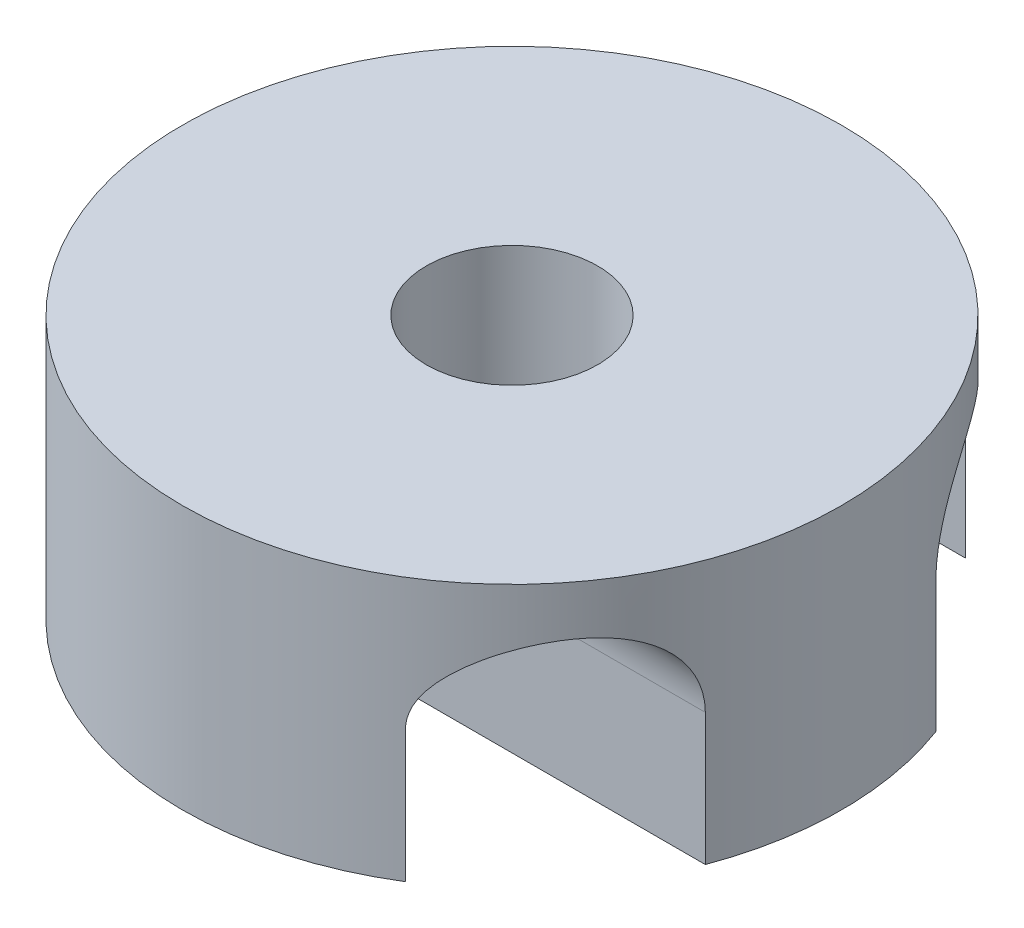
ISO-10303-21;
HEADER;
FILE_DESCRIPTION(('STEP AP214'),'2;1');
FILE_NAME('part.step','',(''),(''),'','','');
FILE_SCHEMA(('AUTOMOTIVE_DESIGN { 1 0 10303 214 1 1 1 1 }'));
ENDSEC;
DATA;
#1=APPLICATION_CONTEXT('core data for automotive mechanical design processes');
#2=APPLICATION_PROTOCOL_DEFINITION('international standard','automotive_design',2000,#1);
#3=PRODUCT_CONTEXT('',#1,'mechanical');
#4=PRODUCT('Part','Part','',(#3));
#5=PRODUCT_RELATED_PRODUCT_CATEGORY('part','',(#4));
#6=PRODUCT_DEFINITION_FORMATION('','',#4);
#7=PRODUCT_DEFINITION_CONTEXT('part definition',#1,'design');
#8=PRODUCT_DEFINITION('design','',#6,#7);
#9=PRODUCT_DEFINITION_SHAPE('','',#8);
#10=(LENGTH_UNIT() NAMED_UNIT(*) SI_UNIT(.MILLI.,.METRE.));
#11=(NAMED_UNIT(*) PLANE_ANGLE_UNIT() SI_UNIT($,.RADIAN.));
#12=(NAMED_UNIT(*) SI_UNIT($,.STERADIAN.) SOLID_ANGLE_UNIT());
#13=UNCERTAINTY_MEASURE_WITH_UNIT(LENGTH_MEASURE(1.E-05),#10,'distance_accuracy_value','');
#14=(GEOMETRIC_REPRESENTATION_CONTEXT(3) GLOBAL_UNCERTAINTY_ASSIGNED_CONTEXT((#13)) GLOBAL_UNIT_ASSIGNED_CONTEXT((#10,
#11,#12)) REPRESENTATION_CONTEXT('',''));
#15=CARTESIAN_POINT('',(0.,0.,0.));
#16=DIRECTION('',(0.,0.,1.));
#17=DIRECTION('',(1.,0.,0.));
#18=AXIS2_PLACEMENT_3D('',#15,#16,#17);
#19=CARTESIAN_POINT('',(0.,0.,0.));
#20=DIRECTION('',(0.,1.,0.));
#21=DIRECTION('',(0.,0.,1.));
#22=AXIS2_PLACEMENT_3D('',#19,#20,#21);
#23=PLANE('',#22);
#24=CARTESIAN_POINT('',(0.,0.,0.));
#25=DIRECTION('',(0.,1.,0.));
#26=DIRECTION('',(0.,0.,1.));
#27=AXIS2_PLACEMENT_3D('',#24,#25,#26);
#28=CIRCLE('',#27,1.651);
#29=CARTESIAN_POINT('',(0.,0.,1.651));
#30=VERTEX_POINT('',#29);
#31=EDGE_CURVE('E121',#30,#30,#28,.T.);
#32=ORIENTED_EDGE('',*,*,#31,.T.);
#33=EDGE_LOOP('',(#32));
#34=FACE_BOUND('',#33,.T.);
#35=DIRECTION('',(-1.,0.,0.));
#36=VECTOR('',#35,1.);
#37=CARTESIAN_POINT('',(7.00617988433738,0.,-2.2225));
#38=LINE('',#37,#36);
#39=CARTESIAN_POINT('',(5.94836059347447,0.,-2.2225));
#40=VERTEX_POINT('',#39);
#41=CARTESIAN_POINT('',(0.,0.,-2.2225));
#42=VERTEX_POINT('',#41);
#43=EDGE_CURVE('E262',#40,#42,#38,.T.);
#44=ORIENTED_EDGE('',*,*,#43,.F.);
#45=CARTESIAN_POINT('',(0.,0.,0.));
#46=DIRECTION('',(0.,1.,0.));
#47=DIRECTION('',(0.,0.,1.));
#48=AXIS2_PLACEMENT_3D('',#45,#46,#47);
#49=CIRCLE('',#48,6.35);
#50=CARTESIAN_POINT('',(5.94836059347447,0.,2.2225));
#51=VERTEX_POINT('',#50);
#52=EDGE_CURVE('E49',#51,#40,#49,.T.);
#53=ORIENTED_EDGE('',*,*,#52,.F.);
#54=DIRECTION('',(1.,0.,0.));
#55=VECTOR('',#54,1.);
#56=CARTESIAN_POINT('',(0.,0.,2.2225));
#57=LINE('',#56,#55);
#58=CARTESIAN_POINT('',(0.,0.,2.2225));
#59=VERTEX_POINT('',#58);
#60=EDGE_CURVE('E174',#59,#51,#57,.T.);
#61=ORIENTED_EDGE('',*,*,#60,.F.);
#62=CARTESIAN_POINT('',(0.,0.,0.));
#63=DIRECTION('',(0.,1.,0.));
#64=DIRECTION('',(0.,0.,-1.));
#65=AXIS2_PLACEMENT_3D('',#62,#63,#64);
#66=CIRCLE('',#65,2.2225);
#67=EDGE_CURVE('E43',#42,#59,#66,.T.);
#68=ORIENTED_EDGE('',*,*,#67,.F.);
#69=EDGE_LOOP('',(#44,#53,#61,#68));
#70=FACE_BOUND('',#69,.T.);
#71=ADVANCED_FACE('F39',(#34,#70),#23,.F.);
#72=CARTESIAN_POINT('',(0.,5.08,0.));
#73=DIRECTION('',(0.,-1.,0.));
#74=DIRECTION('',(0.,0.,-1.));
#75=AXIS2_PLACEMENT_3D('',#72,#73,#74);
#76=CYLINDRICAL_SURFACE('',#75,6.35);
#77=CARTESIAN_POINT('',(0.,5.08,0.));
#78=DIRECTION('',(0.,1.,0.));
#79=DIRECTION('',(0.,0.,1.));
#80=AXIS2_PLACEMENT_3D('',#77,#78,#79);
#81=CIRCLE('',#80,6.35);
#82=CARTESIAN_POINT('',(0.,5.08,6.35));
#83=VERTEX_POINT('',#82);
#84=EDGE_CURVE('E11',#83,#83,#81,.T.);
#85=ORIENTED_EDGE('',*,*,#84,.F.);
#86=EDGE_LOOP('',(#85));
#87=FACE_BOUND('',#86,.T.);
#88=DIRECTION('',(0.,-1.,0.));
#89=VECTOR('',#88,1.);
#90=CARTESIAN_POINT('',(3.34507006653061,1.27,5.3975));
#91=LINE('',#90,#89);
#92=CARTESIAN_POINT('',(3.34507006652884,2.54,5.3975));
#93=VERTEX_POINT('',#92);
#94=CARTESIAN_POINT('',(3.34507006653061,0.,5.3975));
#95=VERTEX_POINT('',#94);
#96=EDGE_CURVE('E63',#93,#95,#91,.T.);
#97=ORIENTED_EDGE('',*,*,#96,.F.);
#98=CARTESIAN_POINT('',(5.94836059347447,2.54,2.2225));
#99=CARTESIAN_POINT('',(5.94835832358748,2.58212873886135,2.2224990610288));
#100=CARTESIAN_POINT('',(5.94773384643831,2.6242370627621,2.22417821665418));
#101=CARTESIAN_POINT('',(5.94522861659639,2.70814670813317,2.2308687928594));
#102=CARTESIAN_POINT('',(5.94334797638651,2.74994805675273,2.23587991507877));
#103=CARTESIAN_POINT('',(5.93581598579431,2.87430354210477,2.25583766864398));
#104=CARTESIAN_POINT('',(5.92827465468238,2.956014821979,2.27570898866582));
#105=CARTESIAN_POINT('',(5.9080071382742,3.11469078973735,2.32781502140145));
#106=CARTESIAN_POINT('',(5.89527935157593,3.19165400312068,2.36005355251134));
#107=CARTESIAN_POINT('',(5.86446914550537,3.33876154887619,2.43560232409667));
#108=CARTESIAN_POINT('',(5.84638727345657,3.40890657726693,2.47891143281611));
#109=CARTESIAN_POINT('',(5.80451202054539,3.54141763891564,2.57544765411664));
#110=CARTESIAN_POINT('',(5.78065351432291,3.6036816713743,2.62878618499652));
#111=CARTESIAN_POINT('',(5.72737166838084,3.71815996843848,2.7429320123225));
#112=CARTESIAN_POINT('',(5.69794684428932,3.77037154484098,2.80374129947801));
#113=CARTESIAN_POINT('',(5.63215611354747,3.8663435835902,2.93374756097584));
#114=CARTESIAN_POINT('',(5.5955175028166,3.90955364971198,3.00321144017914));
#115=CARTESIAN_POINT('',(5.51683764860988,3.98392716544644,3.14541141315939));
#116=CARTESIAN_POINT('',(5.47479480162993,4.01508702856977,3.21814847395012));
#117=CARTESIAN_POINT('',(5.38119308255159,4.06845742413864,3.37257291702332));
#118=CARTESIAN_POINT('',(5.32909738577689,4.08935486858898,3.45438574182686));
#119=CARTESIAN_POINT('',(5.2200613979839,4.11789724771977,3.6170532193894));
#120=CARTESIAN_POINT('',(5.16311848423925,4.12553495940852,3.69790732610437));
#121=CARTESIAN_POINT('',(5.03522280191591,4.12907909554911,3.87072004309037));
#122=CARTESIAN_POINT('',(4.96354795787528,4.12273405051004,3.9621876190562));
#123=CARTESIAN_POINT('',(4.81646318282161,4.09547591790525,4.13974931936101));
#124=CARTESIAN_POINT('',(4.74105064191012,4.07455251379691,4.2258395913494));
#125=CARTESIAN_POINT('',(4.57167722878214,4.01388469586476,4.40918510281611));
#126=CARTESIAN_POINT('',(4.47716963382439,3.97109344474284,4.50494528324074));
#127=CARTESIAN_POINT('',(4.33495744986926,3.89388431605354,4.64057945250455));
#128=CARTESIAN_POINT('',(4.28743304921419,3.8659449253789,4.68449426363894));
#129=CARTESIAN_POINT('',(4.19262187211941,3.80576528432444,4.76953495897004));
#130=CARTESIAN_POINT('',(4.14533500527208,3.77352682314332,4.81066199270906));
#131=CARTESIAN_POINT('',(4.05862086537331,3.70995812039293,4.88393415277602));
#132=CARTESIAN_POINT('',(4.01909394927619,3.67923807326773,4.91649297719177));
#133=CARTESIAN_POINT('',(3.9409176170497,3.61459276872315,4.97937564897764));
#134=CARTESIAN_POINT('',(3.90226784552896,3.58066883924764,5.00970041312352));
#135=CARTESIAN_POINT('',(3.82635575268321,3.50949049308789,5.06791722627807));
#136=CARTESIAN_POINT('',(3.7890913487891,3.47224138763925,5.09581301905295));
#137=CARTESIAN_POINT('',(3.7165407665616,3.39414121947034,5.14896548282318));
#138=CARTESIAN_POINT('',(3.68125341022279,3.35329233979405,5.1742237332937));
#139=CARTESIAN_POINT('',(3.60856239086192,3.26141243096842,5.22522915807943));
#140=CARTESIAN_POINT('',(3.57159968472829,3.20976506600435,5.25051120118989));
#141=CARTESIAN_POINT('',(3.50334498448784,3.10085276572756,5.29629674876956));
#142=CARTESIAN_POINT('',(3.47204622466775,3.04359466035968,5.31680596298366));
#143=CARTESIAN_POINT('',(3.42392060166562,2.9367713963675,5.3478876250299));
#144=CARTESIAN_POINT('',(3.40542355038555,2.88831893505838,5.35965519423118));
#145=CARTESIAN_POINT('',(3.3752067709784,2.78855579581973,5.37873632436665));
#146=CARTESIAN_POINT('',(3.36346694291437,2.73725409765007,5.38606309830967));
#147=CARTESIAN_POINT('',(3.35224378535892,2.66121977288804,5.39304898012775));
#148=CARTESIAN_POINT('',(3.34956541390953,2.63710845444806,5.39471206291081));
#149=CARTESIAN_POINT('',(3.34597461408479,2.58866975821995,5.39693951259093));
#150=CARTESIAN_POINT('',(3.34506474860517,2.56434211811617,5.39750228493943));
#151=CARTESIAN_POINT('',(3.34507006653075,2.54,5.3975));
#152=B_SPLINE_CURVE_WITH_KNOTS('',3,(#98,#99,#100,#101,#102,#103,#104,#105,#106,#107,#108,#109,
#110,#111,#112,#113,#114,#115,#116,#117,#118,#119,#120,#121,#122,#123,#124,#125,#126,#127,#128,
#129,#130,#131,#132,#133,#134,#135,#136,#137,#138,#139,#140,#141,#142,#143,#144,#145,#146,#147,
#148,#149,#150,#151),.UNSPECIFIED.,.F.,.F.,(4,2,2,2,2,2,2,2,2,2,2,2,2,2,2,2,2,2,2,2,2,2,2,2,2,2,
4),(0.,0.126307700925873,0.252604093169524,0.504587717750134,0.756649205374718,1.00868493480504,
1.2637064805433,1.51879612908014,1.7865900632975,2.05446363951522,2.35097842224835,
2.64765467524888,2.99551899711953,3.3436297395155,3.7654408181818,3.97674684151071,
4.18796519580502,4.36699755958602,4.54595604107298,4.72463362274688,4.90320358336435,
5.10779567987462,5.31214174961135,5.47113886637825,5.62966055538371,5.70253091127488,
5.77550679142868),.UNSPECIFIED.);
#153=CARTESIAN_POINT('',(5.94836059347427,2.54,2.2225));
#154=VERTEX_POINT('',#153);
#155=EDGE_CURVE('E195',#154,#93,#152,.T.);
#156=ORIENTED_EDGE('',*,*,#155,.F.);
#157=DIRECTION('',(0.,1.,0.));
#158=VECTOR('',#157,1.);
#159=CARTESIAN_POINT('',(5.94836059347447,1.27,2.2225));
#160=LINE('',#159,#158);
#161=EDGE_CURVE('E192',#51,#154,#160,.T.);
#162=ORIENTED_EDGE('',*,*,#161,.F.);
#163=ORIENTED_EDGE('',*,*,#52,.T.);
#164=DIRECTION('',(0.,-1.,0.));
#165=VECTOR('',#164,1.);
#166=CARTESIAN_POINT('',(5.94836059347447,5.08,-2.2225));
#167=LINE('',#166,#165);
#168=CARTESIAN_POINT('',(5.94836059347447,2.54,-2.2225));
#169=VERTEX_POINT('',#168);
#170=EDGE_CURVE('E117',#169,#40,#167,.T.);
#171=ORIENTED_EDGE('',*,*,#170,.F.);
#172=CARTESIAN_POINT('',(3.34507006653075,2.54,-5.3975));
#173=CARTESIAN_POINT('',(3.34506177274495,2.56580852080798,-5.3975038170099));
#174=CARTESIAN_POINT('',(3.34608637321114,2.59160242900742,-5.39687025143246));
#175=CARTESIAN_POINT('',(3.35012255827613,2.64294156650118,-5.39436628354821));
#176=CARTESIAN_POINT('',(3.35313159926583,2.66848707171439,-5.39249746455322));
#177=CARTESIAN_POINT('',(3.36491922868573,2.74386753991581,-5.38515610376462));
#178=CARTESIAN_POINT('',(3.3764627343995,2.79312136326875,-5.37794644648144));
#179=CARTESIAN_POINT('',(3.4098966848274,2.90251920619687,-5.35682625764473));
#180=CARTESIAN_POINT('',(3.43379692336969,2.9617729461845,-5.34159258728707));
#181=CARTESIAN_POINT('',(3.4889470205276,3.07525574165766,-5.30573648419308));
#182=CARTESIAN_POINT('',(3.52023829009938,3.12945399383819,-5.2850836133309));
#183=CARTESIAN_POINT('',(3.60844352793245,3.26444808521928,-5.22550560941323));
#184=CARTESIAN_POINT('',(3.66928673912606,3.34112232207717,-5.18315090768222));
#185=CARTESIAN_POINT('',(3.79748933586642,3.4828707808405,-5.08998178145815));
#186=CARTESIAN_POINT('',(3.86486057090597,3.54792327499991,-5.03915184773336));
#187=CARTESIAN_POINT('',(3.98520829124238,3.65238922615892,-4.94417978849009));
#188=CARTESIAN_POINT('',(4.03747445073735,3.69411053409755,-4.90163765444903));
#189=CARTESIAN_POINT('',(4.14295237998827,3.77207625062314,-4.81281636367662));
#190=CARTESIAN_POINT('',(4.19616455357972,3.80831825425324,-4.76653557958525));
#191=CARTESIAN_POINT('',(4.3028752213557,3.87538303357948,-4.67043018806566));
#192=CARTESIAN_POINT('',(4.3563738547487,3.90620286965228,-4.62060367875796));
#193=CARTESIAN_POINT('',(4.46308676607741,3.9622778624644,-4.51761903596605));
#194=CARTESIAN_POINT('',(4.51630088624112,3.98753019243465,-4.46445922759017));
#195=CARTESIAN_POINT('',(4.67578478958113,4.05495578509799,-4.29918177955701));
#196=CARTESIAN_POINT('',(4.78099269005764,4.08823146849564,-4.18206944562325));
#197=CARTESIAN_POINT('',(4.93325888824779,4.117419576142,-3.99897629264367));
#198=CARTESIAN_POINT('',(4.98305960449819,4.12369733273171,-3.93675042189794));
#199=CARTESIAN_POINT('',(5.08041424379205,4.12876039709549,-3.81028088839897));
#200=CARTESIAN_POINT('',(5.12796933049516,4.12754962923704,-3.74603830006784));
#201=CARTESIAN_POINT('',(5.23683813649788,4.11507990373289,-3.59300514198917));
#202=CARTESIAN_POINT('',(5.29700429953615,4.10038871758597,-3.50363705506715));
#203=CARTESIAN_POINT('',(5.41090011427771,4.0544165661195,-3.32503654027107));
#204=CARTESIAN_POINT('',(5.46463309092256,4.02314421641194,-3.23580406605821));
#205=CARTESIAN_POINT('',(5.56485738711056,3.94264886856831,-3.06025345542599));
#206=CARTESIAN_POINT('',(5.61128882937401,3.89328749166403,-2.97396354544284));
#207=CARTESIAN_POINT('',(5.69539275037156,3.77667737290553,-2.80954331811824));
#208=CARTESIAN_POINT('',(5.73307196446093,3.7094424718064,-2.73140675197514));
#209=CARTESIAN_POINT('',(5.79488874975794,3.56856922157268,-2.59740352264225));
#210=CARTESIAN_POINT('',(5.8201530453341,3.49691950711942,-2.53996070820819));
#211=CARTESIAN_POINT('',(5.863757866977,3.34325115145933,-2.4376115715246));
#212=CARTESIAN_POINT('',(5.88209931529413,3.26123389334439,-2.39270357961428));
#213=CARTESIAN_POINT('',(5.91075398149945,3.09700484224121,-2.32095975873796));
#214=CARTESIAN_POINT('',(5.92162332234631,3.01542034652849,-2.29289900044516));
#215=CARTESIAN_POINT('',(5.93792070086455,2.84835184375941,-2.2503614498527));
#216=CARTESIAN_POINT('',(5.94335946916037,2.76287587715408,-2.23585787266666));
#217=CARTESIAN_POINT('',(5.94688785390008,2.65407416135563,-2.22643757473753));
#218=CARTESIAN_POINT('',(5.94744068026133,2.63126956096352,-2.2249604021857));
#219=CARTESIAN_POINT('',(5.94817656837301,2.5856463407601,-2.222993090598));
#220=CARTESIAN_POINT('',(5.94836018715193,2.56282779410238,-2.22250146465791));
#221=CARTESIAN_POINT('',(5.94836059347461,2.54,-2.2225));
#222=B_SPLINE_CURVE_WITH_KNOTS('',3,(#172,#173,#174,#175,#176,#177,#178,#179,#180,#181,#182,
#183,#184,#185,#186,#187,#188,#189,#190,#191,#192,#193,#194,#195,#196,#197,#198,#199,#200,#201,
#202,#203,#204,#205,#206,#207,#208,#209,#210,#211,#212,#213,#214,#215,#216,#217,#218,#219,#220,
#221),.UNSPECIFIED.,.F.,.F.,(4,2,2,2,2,2,2,2,2,2,2,2,2,2,2,2,2,2,2,2,2,2,2,2,4),(0.,
0.0773709274128369,0.154642874843087,0.307191843948378,0.503158114711897,0.700249552952321,
1.01845369974905,1.33724666615373,1.57474467289026,1.81234662065774,2.05007698979182,
2.28792778432909,2.76758967533222,3.00711112351227,3.24650706091669,3.57135003672607,
3.89602438852512,4.22323615192005,4.55019526610683,4.8343776907555,5.11852224371287,
5.37815166052293,5.63726703723589,5.70582940988676,5.7742882637029),.UNSPECIFIED.);
#223=CARTESIAN_POINT('',(3.34507006653075,2.54,-5.3975));
#224=VERTEX_POINT('',#223);
#225=EDGE_CURVE('E99',#224,#169,#222,.T.);
#226=ORIENTED_EDGE('',*,*,#225,.F.);
#227=DIRECTION('',(0.,-1.,0.));
#228=VECTOR('',#227,1.);
#229=CARTESIAN_POINT('',(3.34507006653075,5.08,-5.3975));
#230=LINE('',#229,#228);
#231=CARTESIAN_POINT('',(3.34507006653075,0.,-5.3975));
#232=VERTEX_POINT('',#231);
#233=EDGE_CURVE('E111',#232,#224,#230,.F.);
#234=ORIENTED_EDGE('',*,*,#233,.F.);
#235=EDGE_CURVE('E264',#232,#95,#49,.T.);
#236=ORIENTED_EDGE('',*,*,#235,.T.);
#237=EDGE_LOOP('',(#97,#156,#162,#163,#171,#226,#234,#236));
#238=FACE_BOUND('',#237,.T.);
#239=ADVANCED_FACE('F41',(#87,#238),#76,.T.);
#240=CARTESIAN_POINT('',(0.,5.08,0.));
#241=DIRECTION('',(0.,1.,0.));
#242=DIRECTION('',(0.,0.,1.));
#243=AXIS2_PLACEMENT_3D('',#240,#241,#242);
#244=PLANE('',#243);
#245=ORIENTED_EDGE('',*,*,#84,.T.);
#246=EDGE_LOOP('',(#245));
#247=FACE_BOUND('',#246,.T.);
#248=CARTESIAN_POINT('',(0.,5.08,0.));
#249=DIRECTION('',(0.,1.,0.));
#250=DIRECTION('',(0.,0.,1.));
#251=AXIS2_PLACEMENT_3D('',#248,#249,#250);
#252=CIRCLE('',#251,1.651);
#253=CARTESIAN_POINT('',(0.,5.08,1.651));
#254=VERTEX_POINT('',#253);
#255=EDGE_CURVE('E124',#254,#254,#252,.T.);
#256=ORIENTED_EDGE('',*,*,#255,.F.);
#257=EDGE_LOOP('',(#256));
#258=FACE_BOUND('',#257,.T.);
#259=ADVANCED_FACE('F146',(#247,#258),#244,.T.);
#260=ORIENTED_EDGE('',*,*,#235,.F.);
#261=DIRECTION('',(-1.,0.,0.));
#262=VECTOR('',#261,1.);
#263=CARTESIAN_POINT('',(7.00617988433738,0.,-5.3975));
#264=LINE('',#263,#262);
#265=CARTESIAN_POINT('',(0.,0.,-5.3975));
#266=VERTEX_POINT('',#265);
#267=EDGE_CURVE('E106',#232,#266,#264,.T.);
#268=ORIENTED_EDGE('',*,*,#267,.T.);
#269=CARTESIAN_POINT('',(0.,0.,0.));
#270=DIRECTION('',(0.,1.,0.));
#271=DIRECTION('',(0.,0.,-1.));
#272=AXIS2_PLACEMENT_3D('',#269,#270,#271);
#273=CIRCLE('',#272,5.3975);
#274=CARTESIAN_POINT('',(-2.70824762137451E-12,0.,5.3975));
#275=VERTEX_POINT('',#274);
#276=EDGE_CURVE('E162',#266,#275,#273,.T.);
#277=ORIENTED_EDGE('',*,*,#276,.T.);
#278=DIRECTION('',(1.,0.,0.));
#279=VECTOR('',#278,1.);
#280=CARTESIAN_POINT('',(0.,0.,5.3975));
#281=LINE('',#280,#279);
#282=EDGE_CURVE('E57',#275,#95,#281,.T.);
#283=ORIENTED_EDGE('',*,*,#282,.T.);
#284=EDGE_LOOP('',(#260,#268,#277,#283));
#285=FACE_BOUND('',#284,.T.);
#286=ADVANCED_FACE('F143',(#285),#23,.F.);
#287=CARTESIAN_POINT('',(0.,5.08,0.));
#288=DIRECTION('',(0.,-1.,0.));
#289=DIRECTION('',(0.,0.,-1.));
#290=AXIS2_PLACEMENT_3D('',#287,#288,#289);
#291=CYLINDRICAL_SURFACE('',#290,1.651);
#292=ORIENTED_EDGE('',*,*,#255,.T.);
#293=EDGE_LOOP('',(#292));
#294=FACE_BOUND('',#293,.T.);
#295=ORIENTED_EDGE('',*,*,#31,.F.);
#296=EDGE_LOOP('',(#295));
#297=FACE_BOUND('',#296,.T.);
#298=ADVANCED_FACE('F140',(#294,#297),#291,.F.);
#299=CARTESIAN_POINT('',(7.00617988433738,2.54,-2.2225));
#300=DIRECTION('',(0.,0.,1.));
#301=DIRECTION('',(1.,0.,0.));
#302=AXIS2_PLACEMENT_3D('',#299,#300,#301);
#303=PLANE('',#302);
#304=ORIENTED_EDGE('',*,*,#170,.T.);
#305=ORIENTED_EDGE('',*,*,#43,.T.);
#306=DIRECTION('',(0.,1.,0.));
#307=VECTOR('',#306,1.);
#308=CARTESIAN_POINT('',(0.,2.54,-2.2225));
#309=LINE('',#308,#307);
#310=CARTESIAN_POINT('',(0.,2.54,-2.2225));
#311=VERTEX_POINT('',#310);
#312=EDGE_CURVE('E187',#42,#311,#309,.T.);
#313=ORIENTED_EDGE('',*,*,#312,.T.);
#314=DIRECTION('',(-1.,0.,0.));
#315=VECTOR('',#314,1.);
#316=CARTESIAN_POINT('',(7.00617988433738,2.54,-2.2225));
#317=LINE('',#316,#315);
#318=EDGE_CURVE('E107',#169,#311,#317,.T.);
#319=ORIENTED_EDGE('',*,*,#318,.F.);
#320=EDGE_LOOP('',(#304,#305,#313,#319));
#321=FACE_BOUND('',#320,.T.);
#322=ADVANCED_FACE('F139',(#321),#303,.F.);
#323=CARTESIAN_POINT('',(7.00617988433738,2.54,-3.81));
#324=DIRECTION('',(-1.,0.,0.));
#325=DIRECTION('',(0.,0.,1.));
#326=AXIS2_PLACEMENT_3D('',#323,#324,#325);
#327=CYLINDRICAL_SURFACE('',#326,1.5875);
#328=ORIENTED_EDGE('',*,*,#225,.T.);
#329=ORIENTED_EDGE('',*,*,#318,.T.);
#330=CARTESIAN_POINT('',(0.,2.54,-3.81));
#331=DIRECTION('',(-1.,0.,0.));
#332=DIRECTION('',(0.,0.,1.));
#333=AXIS2_PLACEMENT_3D('',#330,#331,#332);
#334=CIRCLE('',#333,1.5875);
#335=CARTESIAN_POINT('',(0.,2.54,-5.3975));
#336=VERTEX_POINT('',#335);
#337=EDGE_CURVE('E102',#311,#336,#334,.T.);
#338=ORIENTED_EDGE('',*,*,#337,.T.);
#339=DIRECTION('',(-1.,0.,0.));
#340=VECTOR('',#339,1.);
#341=CARTESIAN_POINT('',(7.00617988433738,2.54,-5.3975));
#342=LINE('',#341,#340);
#343=EDGE_CURVE('E95',#224,#336,#342,.T.);
#344=ORIENTED_EDGE('',*,*,#343,.F.);
#345=EDGE_LOOP('',(#328,#329,#338,#344));
#346=FACE_BOUND('',#345,.T.);
#347=ADVANCED_FACE('F97',(#346),#327,.F.);
#348=CARTESIAN_POINT('',(7.00617988433738,2.54,-5.3975));
#349=DIRECTION('',(0.,0.,-1.));
#350=DIRECTION('',(-1.,0.,0.));
#351=AXIS2_PLACEMENT_3D('',#348,#349,#350);
#352=PLANE('',#351);
#353=ORIENTED_EDGE('',*,*,#233,.T.);
#354=ORIENTED_EDGE('',*,*,#343,.T.);
#355=DIRECTION('',(0.,-1.,0.));
#356=VECTOR('',#355,1.);
#357=CARTESIAN_POINT('',(0.,2.54,-5.3975));
#358=LINE('',#357,#356);
#359=EDGE_CURVE('E169',#336,#266,#358,.T.);
#360=ORIENTED_EDGE('',*,*,#359,.T.);
#361=ORIENTED_EDGE('',*,*,#267,.F.);
#362=EDGE_LOOP('',(#353,#354,#360,#361));
#363=FACE_BOUND('',#362,.T.);
#364=ADVANCED_FACE('F112',(#363),#352,.F.);
#365=CARTESIAN_POINT('',(0.,0.,-2.2225));
#366=CARTESIAN_POINT('',(-0.583322419022481,0.,-2.2225));
#367=CARTESIAN_POINT('',(-1.16011619937372,0.,-1.98297344300049));
#368=CARTESIAN_POINT('',(-1.98297344300049,0.,-1.16011619937372));
#369=CARTESIAN_POINT('',(-2.2225,0.,-0.58184793691743));
#370=CARTESIAN_POINT('',(-2.2225,0.,0.581847936917438));
#371=CARTESIAN_POINT('',(-1.98297344300032,0.,1.16011619937377));
#372=CARTESIAN_POINT('',(-1.36583051028049,0.,1.77725913209377));
#373=CARTESIAN_POINT('',(-1.11950411647658,0.,1.94190287697265));
#374=CARTESIAN_POINT('',(-0.716018834408817,0.,2.10903195302318));
#375=CARTESIAN_POINT('',(-0.576048449339283,0.,2.15147096884471));
#376=CARTESIAN_POINT('',(-0.362076145259762,0.,2.19401352299666));
#377=CARTESIAN_POINT('',(-0.290082778974273,0.,2.20468626051726));
#378=CARTESIAN_POINT('',(-0.181578096339217,0.,2.21536824567185));
#379=CARTESIAN_POINT('',(-0.145323648975223,0.,2.2180415648846));
#380=CARTESIAN_POINT('',(-0.0727173780643446,0.,2.22160742017352));
#381=CARTESIAN_POINT('',(-0.0493532376384455,0.,2.2224976138175));
#382=CARTESIAN_POINT('',(0.0577766130416832,0.,2.22250279344476));
#383=CARTESIAN_POINT('',(0.145962080923696,0.,2.2225));
#384=CARTESIAN_POINT('',(0.291924161847394,0.,2.2225));
#385=CARTESIAN_POINT('',(0.364905202309247,0.,2.2225));
#386=CARTESIAN_POINT('',(0.583848323694788,0.,2.2225));
#387=CARTESIAN_POINT('',(0.729810404618452,0.,2.2225));
#388=CARTESIAN_POINT('',(1.16769664738959,0.,2.2225));
#389=CARTESIAN_POINT('',(1.45962080923702,0.,2.2225));
#390=CARTESIAN_POINT('',(2.33539329477902,0.,2.2225));
#391=CARTESIAN_POINT('',(2.91924161847396,0.,2.2225));
#392=CARTESIAN_POINT('',(4.67078658955814,0.,2.2225));
#393=CARTESIAN_POINT('',(5.8384832369479,0.,2.2225));
#394=CARTESIAN_POINT('',(7.00617988433738,0.,2.2225));
#395=CARTESIAN_POINT('',(0.,2.54,-2.2225));
#396=CARTESIAN_POINT('',(-0.583322419022481,2.54,-2.2225));
#397=CARTESIAN_POINT('',(-1.16011619937372,2.54,-1.98297344300049));
#398=CARTESIAN_POINT('',(-1.98297344300049,2.54,-1.16011619937372));
#399=CARTESIAN_POINT('',(-2.2225,2.54,-0.58184793691743));
#400=CARTESIAN_POINT('',(-2.2225,2.54,0.581847936917438));
#401=CARTESIAN_POINT('',(-1.98297344300032,2.54,1.16011619937377));
#402=CARTESIAN_POINT('',(-1.36583051028049,2.54,1.77725913209377));
#403=CARTESIAN_POINT('',(-1.11950411647658,2.54,1.94190287697265));
#404=CARTESIAN_POINT('',(-0.716018834408817,2.54,2.10903195302318));
#405=CARTESIAN_POINT('',(-0.576048449339283,2.54,2.15147096884471));
#406=CARTESIAN_POINT('',(-0.362076145259762,2.54,2.19401352299666));
#407=CARTESIAN_POINT('',(-0.290082778974273,2.54,2.20468626051726));
#408=CARTESIAN_POINT('',(-0.181578096339217,2.54,2.21536824567185));
#409=CARTESIAN_POINT('',(-0.145323648975223,2.54,2.2180415648846));
#410=CARTESIAN_POINT('',(-0.0727173780643446,2.54,2.22160742017352));
#411=CARTESIAN_POINT('',(-0.0493532376384455,2.54,2.2224976138175));
#412=CARTESIAN_POINT('',(0.0577766130416832,2.54,2.22250279344476));
#413=CARTESIAN_POINT('',(0.145962080923696,2.54,2.2225));
#414=CARTESIAN_POINT('',(0.291924161847394,2.54,2.2225));
#415=CARTESIAN_POINT('',(0.364905202309247,2.54,2.2225));
#416=CARTESIAN_POINT('',(0.583848323694788,2.54,2.2225));
#417=CARTESIAN_POINT('',(0.729810404618452,2.54,2.2225));
#418=CARTESIAN_POINT('',(1.16769664738959,2.54,2.2225));
#419=CARTESIAN_POINT('',(1.45962080923702,2.54,2.2225));
#420=CARTESIAN_POINT('',(2.33539329477902,2.54,2.2225));
#421=CARTESIAN_POINT('',(2.91924161847396,2.54,2.2225));
#422=CARTESIAN_POINT('',(4.67078658955814,2.54,2.2225));
#423=CARTESIAN_POINT('',(5.8384832369479,2.54,2.2225));
#424=CARTESIAN_POINT('',(7.00617988433738,2.54,2.2225));
#425=B_SPLINE_SURFACE_WITH_KNOTS('',1,3,((#365,#366,#367,#368,#369,#370,#371,#372,#373,#374,
#375,#376,#377,#378,#379,#380,#381,#382,#383,#384,#385,#386,#387,#388,#389,#390,#391,#392,#393,
#394),(#395,#396,#397,#398,#399,#400,#401,#402,#403,#404,#405,#406,#407,#408,#409,#410,#411,
#412,#413,#414,#415,#416,#417,#418,#419,#420,#421,#422,#423,#424)),.UNSPECIFIED.,.F.,.F.,.F.,(2,
2),(4,2,2,2,2,2,2,2,2,2,2,2,2,2,4),(0.,1.),(0.269656928833934,0.384828464416967,0.5,
0.615171535583033,0.67275730337455,0.701550187270308,0.715946629218187,0.723144850192127,
0.730343071166066,0.738769850192127,0.747196629218187,0.764050187270308,0.79775730337455,
0.865171535583033,1.),.UNSPECIFIED.);
#426=CARTESIAN_POINT('',(0.,2.54,-2.2225));
#427=CARTESIAN_POINT('',(-0.583322419022481,2.54,-2.2225));
#428=CARTESIAN_POINT('',(-1.16011619937372,2.54,-1.98297344300049));
#429=CARTESIAN_POINT('',(-1.98297344300049,2.54,-1.16011619937372));
#430=CARTESIAN_POINT('',(-2.2225,2.54,-0.58184793691743));
#431=CARTESIAN_POINT('',(-2.2225,2.54,0.581847936917438));
#432=CARTESIAN_POINT('',(-1.98297344300032,2.54,1.16011619937377));
#433=CARTESIAN_POINT('',(-1.36583051028049,2.54,1.77725913209377));
#434=CARTESIAN_POINT('',(-1.11950411647658,2.54,1.94190287697265));
#435=CARTESIAN_POINT('',(-0.716018834408817,2.54,2.10903195302318));
#436=CARTESIAN_POINT('',(-0.576048449339283,2.54,2.15147096884471));
#437=CARTESIAN_POINT('',(-0.362076145259762,2.54,2.19401352299666));
#438=CARTESIAN_POINT('',(-0.290082778974273,2.54,2.20468626051726));
#439=CARTESIAN_POINT('',(-0.181578096339217,2.54,2.21536824567185));
#440=CARTESIAN_POINT('',(-0.145323648975223,2.54,2.2180415648846));
#441=CARTESIAN_POINT('',(-0.0727173780643446,2.54,2.22160742017352));
#442=CARTESIAN_POINT('',(-0.0493532376384455,2.54,2.2224976138175));
#443=CARTESIAN_POINT('',(0.0577766130416832,2.54,2.22250279344476));
#444=CARTESIAN_POINT('',(0.145962080923696,2.54,2.2225));
#445=CARTESIAN_POINT('',(0.291924161847394,2.54,2.2225));
#446=CARTESIAN_POINT('',(0.364905202309247,2.54,2.2225));
#447=CARTESIAN_POINT('',(0.583848323694788,2.54,2.2225));
#448=CARTESIAN_POINT('',(0.729810404618452,2.54,2.2225));
#449=CARTESIAN_POINT('',(1.16769664738959,2.54,2.2225));
#450=CARTESIAN_POINT('',(1.45962080923702,2.54,2.2225));
#451=CARTESIAN_POINT('',(2.33539329477902,2.54,2.2225));
#452=CARTESIAN_POINT('',(2.91924161847396,2.54,2.2225));
#453=CARTESIAN_POINT('',(4.67078658955814,2.54,2.2225));
#454=CARTESIAN_POINT('',(5.8384832369479,2.54,2.2225));
#455=CARTESIAN_POINT('',(7.00617988433738,2.54,2.2225));
#456=B_SPLINE_CURVE_WITH_KNOTS('',3,(#426,#427,#428,#429,#430,#431,#432,#433,#434,#435,#436,
#437,#438,#439,#440,#441,#442,#443,#444,#445,#446,#447,#448,#449,#450,#451,#452,#453,#454,#455),
.UNSPECIFIED.,.F.,.F.,(4,2,2,2,2,2,2,2,2,2,2,2,2,2,4),(0.269656928833934,0.384828464416967,0.5,
0.615171535583033,0.67275730337455,0.701550187270308,0.715946629218187,0.723144850192127,
0.730343071166066,0.738769850192127,0.747196629218187,0.764050187270308,0.79775730337455,
0.865171535583033,1.),.UNSPECIFIED.);
#457=EDGE_CURVE('E183',#311,#154,#456,.T.);
#458=ORIENTED_EDGE('',*,*,#161,.T.);
#459=ORIENTED_EDGE('',*,*,#457,.F.);
#460=ORIENTED_EDGE('',*,*,#312,.F.);
#461=ORIENTED_EDGE('',*,*,#67,.T.);
#462=ORIENTED_EDGE('',*,*,#60,.T.);
#463=EDGE_LOOP('',(#458,#459,#460,#461,#462));
#464=FACE_BOUND('',#463,.T.);
#465=ADVANCED_FACE('F213',(#464),#425,.F.);
#466=CARTESIAN_POINT('',(0.,2.54,-2.2225));
#467=CARTESIAN_POINT('',(-0.583322419022481,2.54,-2.2225));
#468=CARTESIAN_POINT('',(-1.16011619937372,2.54,-1.98297344300049));
#469=CARTESIAN_POINT('',(-1.98297344300049,2.54,-1.16011619937372));
#470=CARTESIAN_POINT('',(-2.2225,2.54,-0.58184793691743));
#471=CARTESIAN_POINT('',(-2.2225,2.54,0.581847936917438));
#472=CARTESIAN_POINT('',(-1.98297344300032,2.54,1.16011619937377));
#473=CARTESIAN_POINT('',(-1.36583051028049,2.54,1.77725913209377));
#474=CARTESIAN_POINT('',(-1.11950411647658,2.54,1.94190287697265));
#475=CARTESIAN_POINT('',(-0.716018834408817,2.54,2.10903195302318));
#476=CARTESIAN_POINT('',(-0.576048449339283,2.54,2.15147096884471));
#477=CARTESIAN_POINT('',(-0.362076145259762,2.54,2.19401352299666));
#478=CARTESIAN_POINT('',(-0.290082778974273,2.54,2.20468626051726));
#479=CARTESIAN_POINT('',(-0.181578096339217,2.54,2.21536824567185));
#480=CARTESIAN_POINT('',(-0.145323648975223,2.54,2.2180415648846));
#481=CARTESIAN_POINT('',(-0.0727173780643446,2.54,2.22160742017352));
#482=CARTESIAN_POINT('',(-0.0493532376384455,2.54,2.2224976138175));
#483=CARTESIAN_POINT('',(0.0577766130416832,2.54,2.22250279344476));
#484=CARTESIAN_POINT('',(0.145962080923696,2.54,2.2225));
#485=CARTESIAN_POINT('',(0.291924161847394,2.54,2.2225));
#486=CARTESIAN_POINT('',(0.364905202309247,2.54,2.2225));
#487=CARTESIAN_POINT('',(0.583848323694788,2.54,2.2225));
#488=CARTESIAN_POINT('',(0.729810404618452,2.54,2.2225));
#489=CARTESIAN_POINT('',(1.16769664738959,2.54,2.2225));
#490=CARTESIAN_POINT('',(1.45962080923702,2.54,2.2225));
#491=CARTESIAN_POINT('',(2.33539329477902,2.54,2.2225));
#492=CARTESIAN_POINT('',(2.91924161847396,2.54,2.2225));
#493=CARTESIAN_POINT('',(4.67078658955814,2.54,2.2225));
#494=CARTESIAN_POINT('',(5.8384832369479,2.54,2.2225));
#495=CARTESIAN_POINT('',(7.00617988433738,2.54,2.2225));
#496=CARTESIAN_POINT('',(0.,5.715,-2.2225));
#497=CARTESIAN_POINT('',(-0.583322419022481,5.715,-2.2225));
#498=CARTESIAN_POINT('',(-1.16011619937372,5.715,-1.98297344300049));
#499=CARTESIAN_POINT('',(-1.98297344300049,5.715,-1.16011619937372));
#500=CARTESIAN_POINT('',(-2.2225,5.715,-0.58184793691743));
#501=CARTESIAN_POINT('',(-2.2225,5.715,0.581847936917438));
#502=CARTESIAN_POINT('',(-1.98297344300032,5.715,1.16011619937377));
#503=CARTESIAN_POINT('',(-1.36583051028049,5.715,1.77725913209377));
#504=CARTESIAN_POINT('',(-1.11950411647658,5.715,1.94190287697265));
#505=CARTESIAN_POINT('',(-0.716018834408817,5.715,2.10903195302318));
#506=CARTESIAN_POINT('',(-0.576048449339283,5.715,2.15147096884471));
#507=CARTESIAN_POINT('',(-0.362076145259762,5.715,2.19401352299666));
#508=CARTESIAN_POINT('',(-0.290082778974273,5.715,2.20468626051726));
#509=CARTESIAN_POINT('',(-0.181578096339217,5.715,2.21536824567185));
#510=CARTESIAN_POINT('',(-0.145323648975223,5.715,2.2180415648846));
#511=CARTESIAN_POINT('',(-0.0727173780643446,5.715,2.22160742017352));
#512=CARTESIAN_POINT('',(-0.0493532376384455,5.715,2.2224976138175));
#513=CARTESIAN_POINT('',(0.0577766130416832,5.715,2.22250279344476));
#514=CARTESIAN_POINT('',(0.145962080923696,5.715,2.2225));
#515=CARTESIAN_POINT('',(0.291924161847394,5.715,2.2225));
#516=CARTESIAN_POINT('',(0.364905202309247,5.715,2.2225));
#517=CARTESIAN_POINT('',(0.583848323694788,5.715,2.2225));
#518=CARTESIAN_POINT('',(0.729810404618452,5.715,2.2225));
#519=CARTESIAN_POINT('',(1.16769664738959,5.715,2.2225));
#520=CARTESIAN_POINT('',(1.45962080923702,5.715,2.2225));
#521=CARTESIAN_POINT('',(2.33539329477902,5.715,2.2225));
#522=CARTESIAN_POINT('',(2.91924161847396,5.715,2.2225));
#523=CARTESIAN_POINT('',(4.67078658955814,5.715,2.2225));
#524=CARTESIAN_POINT('',(5.8384832369479,5.715,2.2225));
#525=CARTESIAN_POINT('',(7.00617988433738,5.715,2.2225));
#526=CARTESIAN_POINT('',(0.,5.715,-5.3975));
#527=CARTESIAN_POINT('',(-1.41664016048311,5.715,-5.3975));
#528=CARTESIAN_POINT('',(-2.81742505562196,5.715,-4.81579264728725));
#529=CARTESIAN_POINT('',(-4.81579264728682,5.715,-2.81742505562152));
#530=CARTESIAN_POINT('',(-5.3975,5.715,-1.4130592753709));
#531=CARTESIAN_POINT('',(-5.3975,5.715,1.41305927537092));
#532=CARTESIAN_POINT('',(-4.81579264728631,5.715,2.81742505562203));
#533=CARTESIAN_POINT('',(-3.31701695353842,5.715,4.31620074937057));
#534=CARTESIAN_POINT('',(-2.71879571144312,5.715,4.71604984407657));
#535=CARTESIAN_POINT('',(-1.73890288356427,5.715,5.12193474305623));
#536=CARTESIAN_POINT('',(-1.39897480553825,5.715,5.22500092433718));
#537=CARTESIAN_POINT('',(-0.879327781345144,5.715,5.32831855584903));
#538=CARTESIAN_POINT('',(-0.70448674893752,5.715,5.35423806125617));
#539=CARTESIAN_POINT('',(-0.440975376823813,5.715,5.38018002520309));
#540=CARTESIAN_POINT('',(-0.35292886179697,5.715,5.38667237186257));
#541=CARTESIAN_POINT('',(-0.176599346727694,5.715,5.39533230613571));
#542=CARTESIAN_POINT('',(-0.0753285919651155,5.715,5.39749420498535));
#543=CARTESIAN_POINT('',(0.0881853170571528,5.715,5.39750678408014));
#544=CARTESIAN_POINT('',(0.145962080923696,5.715,5.3975));
#545=CARTESIAN_POINT('',(0.291924161847394,5.715,5.3975));
#546=CARTESIAN_POINT('',(0.364905202309247,5.715,5.3975));
#547=CARTESIAN_POINT('',(0.583848323694788,5.715,5.3975));
#548=CARTESIAN_POINT('',(0.729810404618452,5.715,5.3975));
#549=CARTESIAN_POINT('',(1.16769664738959,5.715,5.3975));
#550=CARTESIAN_POINT('',(1.45962080923702,5.715,5.3975));
#551=CARTESIAN_POINT('',(2.33539329477902,5.715,5.3975));
#552=CARTESIAN_POINT('',(2.91924161847396,5.715,5.3975));
#553=CARTESIAN_POINT('',(4.67078658955814,5.715,5.3975));
#554=CARTESIAN_POINT('',(5.8384832369479,5.715,5.3975));
#555=CARTESIAN_POINT('',(7.00617988433738,5.715,5.3975));
#556=CARTESIAN_POINT('',(0.,2.54,-5.3975));
#557=CARTESIAN_POINT('',(-1.41664016048311,2.54,-5.3975));
#558=CARTESIAN_POINT('',(-2.81742505562196,2.54,-4.81579264728725));
#559=CARTESIAN_POINT('',(-4.81579264728682,2.54,-2.81742505562152));
#560=CARTESIAN_POINT('',(-5.3975,2.54,-1.4130592753709));
#561=CARTESIAN_POINT('',(-5.3975,2.54,1.41305927537092));
#562=CARTESIAN_POINT('',(-4.81579264728631,2.54,2.81742505562203));
#563=CARTESIAN_POINT('',(-3.31701695353842,2.54,4.31620074937057));
#564=CARTESIAN_POINT('',(-2.71879571144312,2.54,4.71604984407657));
#565=CARTESIAN_POINT('',(-1.73890288356427,2.54,5.12193474305623));
#566=CARTESIAN_POINT('',(-1.39897480553825,2.54,5.22500092433718));
#567=CARTESIAN_POINT('',(-0.879327781345144,2.54,5.32831855584903));
#568=CARTESIAN_POINT('',(-0.70448674893752,2.54,5.35423806125617));
#569=CARTESIAN_POINT('',(-0.440975376823813,2.54,5.38018002520309));
#570=CARTESIAN_POINT('',(-0.35292886179697,2.54,5.38667237186257));
#571=CARTESIAN_POINT('',(-0.176599346727694,2.54,5.39533230613571));
#572=CARTESIAN_POINT('',(-0.0753285919651155,2.54,5.39749420498535));
#573=CARTESIAN_POINT('',(0.0881853170571528,2.54,5.39750678408014));
#574=CARTESIAN_POINT('',(0.145962080923696,2.54,5.3975));
#575=CARTESIAN_POINT('',(0.291924161847394,2.54,5.3975));
#576=CARTESIAN_POINT('',(0.364905202309247,2.54,5.3975));
#577=CARTESIAN_POINT('',(0.583848323694788,2.54,5.3975));
#578=CARTESIAN_POINT('',(0.729810404618452,2.54,5.3975));
#579=CARTESIAN_POINT('',(1.16769664738959,2.54,5.3975));
#580=CARTESIAN_POINT('',(1.45962080923702,2.54,5.3975));
#581=CARTESIAN_POINT('',(2.33539329477902,2.54,5.3975));
#582=CARTESIAN_POINT('',(2.91924161847396,2.54,5.3975));
#583=CARTESIAN_POINT('',(4.67078658955814,2.54,5.3975));
#584=CARTESIAN_POINT('',(5.8384832369479,2.54,5.3975));
#585=CARTESIAN_POINT('',(7.00617988433738,2.54,5.3975));
#586=(BOUNDED_SURFACE() B_SPLINE_SURFACE(3,3,((#466,#467,#468,#469,#470,#471,#472,#473,#474,
#475,#476,#477,#478,#479,#480,#481,#482,#483,#484,#485,#486,#487,#488,#489,#490,#491,#492,#493,
#494,#495),(#496,#497,#498,#499,#500,#501,#502,#503,#504,#505,#506,#507,#508,#509,#510,#511,
#512,#513,#514,#515,#516,#517,#518,#519,#520,#521,#522,#523,#524,#525),(#526,#527,#528,#529,
#530,#531,#532,#533,#534,#535,#536,#537,#538,#539,#540,#541,#542,#543,#544,#545,#546,#547,#548,
#549,#550,#551,#552,#553,#554,#555),(#556,#557,#558,#559,#560,#561,#562,#563,#564,#565,#566,
#567,#568,#569,#570,#571,#572,#573,#574,#575,#576,#577,#578,#579,#580,#581,#582,#583,#584,
#585)),.UNSPECIFIED.,.F.,.F.,.F.) B_SPLINE_SURFACE_WITH_KNOTS((4,4),(4,2,2,2,2,2,2,2,2,2,2,2,2,
2,4),(0.,1.),(0.269656928833934,0.384828464416967,0.5,0.615171535583033,0.67275730337455,
0.701550187270308,0.715946629218187,0.723144850192127,0.730343071166066,0.738769850192127,
0.747196629218187,0.764050187270308,0.79775730337455,0.865171535583033,1.),
.UNSPECIFIED.) GEOMETRIC_REPRESENTATION_ITEM() RATIONAL_B_SPLINE_SURFACE(((1.,1.,1.,1.,1.,1.,1.,
1.,1.,1.,1.,1.,1.,1.,1.,1.,1.,1.,1.,1.,1.,1.,1.,1.,1.,1.,1.,1.,1.,1.),(0.333333333333333,
0.333333333333333,0.333333333333333,0.333333333333333,0.333333333333333,0.333333333333333,
0.333333333333333,0.333333333333333,0.333333333333333,0.333333333333333,0.333333333333333,
0.333333333333333,0.333333333333333,0.333333333333333,0.333333333333333,0.333333333333333,
0.333333333333333,0.333333333333333,0.333333333333333,0.333333333333333,0.333333333333333,
0.333333333333333,0.333333333333333,0.333333333333333,0.333333333333333,0.333333333333333,
0.333333333333333,0.333333333333333,0.333333333333333,0.333333333333333),(0.333333333333333,
0.333333333333333,0.333333333333333,0.333333333333333,0.333333333333333,0.333333333333333,
0.333333333333333,0.333333333333333,0.333333333333333,0.333333333333333,0.333333333333333,
0.333333333333333,0.333333333333333,0.333333333333333,0.333333333333333,0.333333333333333,
0.333333333333333,0.333333333333333,0.333333333333333,0.333333333333333,0.333333333333333,
0.333333333333333,0.333333333333333,0.333333333333333,0.333333333333333,0.333333333333333,
0.333333333333333,0.333333333333333,0.333333333333333,0.333333333333333),(1.,1.,1.,1.,1.,1.,1.,
1.,1.,1.,1.,1.,1.,1.,1.,1.,1.,1.,1.,1.,1.,1.,1.,1.,1.,1.,1.,1.,1.,1.))) REPRESENTATION_ITEM('') SURFACE());
#587=CARTESIAN_POINT('',(0.,2.54,-5.3975));
#588=CARTESIAN_POINT('',(-1.41664016048311,2.54,-5.3975));
#589=CARTESIAN_POINT('',(-2.81742505562196,2.54,-4.81579264728725));
#590=CARTESIAN_POINT('',(-4.81579264728682,2.54,-2.81742505562152));
#591=CARTESIAN_POINT('',(-5.3975,2.54,-1.4130592753709));
#592=CARTESIAN_POINT('',(-5.3975,2.54,1.41305927537092));
#593=CARTESIAN_POINT('',(-4.81579264728631,2.54,2.81742505562203));
#594=CARTESIAN_POINT('',(-3.31701695353842,2.54,4.31620074937057));
#595=CARTESIAN_POINT('',(-2.71879571144312,2.54,4.71604984407657));
#596=CARTESIAN_POINT('',(-1.73890288356427,2.54,5.12193474305623));
#597=CARTESIAN_POINT('',(-1.39897480553825,2.54,5.22500092433718));
#598=CARTESIAN_POINT('',(-0.879327781345144,2.54,5.32831855584903));
#599=CARTESIAN_POINT('',(-0.70448674893752,2.54,5.35423806125617));
#600=CARTESIAN_POINT('',(-0.440975376823813,2.54,5.38018002520309));
#601=CARTESIAN_POINT('',(-0.35292886179697,2.54,5.38667237186257));
#602=CARTESIAN_POINT('',(-0.176599346727694,2.54,5.39533230613571));
#603=CARTESIAN_POINT('',(-0.0753285919651155,2.54,5.39749420498535));
#604=CARTESIAN_POINT('',(0.0881853170571528,2.54,5.39750678408014));
#605=CARTESIAN_POINT('',(0.145962080923696,2.54,5.3975));
#606=CARTESIAN_POINT('',(0.291924161847394,2.54,5.3975));
#607=CARTESIAN_POINT('',(0.364905202309247,2.54,5.3975));
#608=CARTESIAN_POINT('',(0.583848323694788,2.54,5.3975));
#609=CARTESIAN_POINT('',(0.729810404618452,2.54,5.3975));
#610=CARTESIAN_POINT('',(1.16769664738959,2.54,5.3975));
#611=CARTESIAN_POINT('',(1.45962080923702,2.54,5.3975));
#612=CARTESIAN_POINT('',(2.33539329477902,2.54,5.3975));
#613=CARTESIAN_POINT('',(2.91924161847396,2.54,5.3975));
#614=CARTESIAN_POINT('',(4.67078658955814,2.54,5.3975));
#615=CARTESIAN_POINT('',(5.8384832369479,2.54,5.3975));
#616=CARTESIAN_POINT('',(7.00617988433738,2.54,5.3975));
#617=B_SPLINE_CURVE_WITH_KNOTS('',3,(#587,#588,#589,#590,#591,#592,#593,#594,#595,#596,#597,
#598,#599,#600,#601,#602,#603,#604,#605,#606,#607,#608,#609,#610,#611,#612,#613,#614,#615,#616),
.UNSPECIFIED.,.F.,.F.,(4,2,2,2,2,2,2,2,2,2,2,2,2,2,4),(0.269656928833934,0.384828464416967,0.5,
0.615171535583033,0.67275730337455,0.701550187270308,0.715946629218187,0.723144850192127,
0.730343071166066,0.738769850192127,0.747196629218187,0.764050187270308,0.79775730337455,
0.865171535583033,1.),.UNSPECIFIED.);
#618=EDGE_CURVE('E254',#336,#93,#617,.T.);
#619=ORIENTED_EDGE('',*,*,#155,.T.);
#620=ORIENTED_EDGE('',*,*,#618,.F.);
#621=ORIENTED_EDGE('',*,*,#337,.F.);
#622=ORIENTED_EDGE('',*,*,#457,.T.);
#623=EDGE_LOOP('',(#619,#620,#621,#622));
#624=FACE_BOUND('',#623,.T.);
#625=ADVANCED_FACE('F219',(#624),#586,.F.);
#626=CARTESIAN_POINT('',(0.,2.54,-5.3975));
#627=CARTESIAN_POINT('',(-1.41664016048311,2.54,-5.3975));
#628=CARTESIAN_POINT('',(-2.81742505562196,2.54,-4.81579264728725));
#629=CARTESIAN_POINT('',(-4.81579264728682,2.54,-2.81742505562152));
#630=CARTESIAN_POINT('',(-5.3975,2.54,-1.4130592753709));
#631=CARTESIAN_POINT('',(-5.3975,2.54,1.41305927537092));
#632=CARTESIAN_POINT('',(-4.81579264728631,2.54,2.81742505562203));
#633=CARTESIAN_POINT('',(-3.31701695353842,2.54,4.31620074937057));
#634=CARTESIAN_POINT('',(-2.71879571144312,2.54,4.71604984407657));
#635=CARTESIAN_POINT('',(-1.73890288356427,2.54,5.12193474305623));
#636=CARTESIAN_POINT('',(-1.39897480553825,2.54,5.22500092433718));
#637=CARTESIAN_POINT('',(-0.879327781345144,2.54,5.32831855584903));
#638=CARTESIAN_POINT('',(-0.70448674893752,2.54,5.35423806125617));
#639=CARTESIAN_POINT('',(-0.440975376823813,2.54,5.38018002520309));
#640=CARTESIAN_POINT('',(-0.35292886179697,2.54,5.38667237186257));
#641=CARTESIAN_POINT('',(-0.176599346727694,2.54,5.39533230613571));
#642=CARTESIAN_POINT('',(-0.0753285919651155,2.54,5.39749420498535));
#643=CARTESIAN_POINT('',(0.0881853170571528,2.54,5.39750678408014));
#644=CARTESIAN_POINT('',(0.145962080923696,2.54,5.3975));
#645=CARTESIAN_POINT('',(0.291924161847394,2.54,5.3975));
#646=CARTESIAN_POINT('',(0.364905202309247,2.54,5.3975));
#647=CARTESIAN_POINT('',(0.583848323694788,2.54,5.3975));
#648=CARTESIAN_POINT('',(0.729810404618452,2.54,5.3975));
#649=CARTESIAN_POINT('',(1.16769664738959,2.54,5.3975));
#650=CARTESIAN_POINT('',(1.45962080923702,2.54,5.3975));
#651=CARTESIAN_POINT('',(2.33539329477902,2.54,5.3975));
#652=CARTESIAN_POINT('',(2.91924161847396,2.54,5.3975));
#653=CARTESIAN_POINT('',(4.67078658955814,2.54,5.3975));
#654=CARTESIAN_POINT('',(5.8384832369479,2.54,5.3975));
#655=CARTESIAN_POINT('',(7.00617988433738,2.54,5.3975));
#656=CARTESIAN_POINT('',(0.,0.,-5.3975));
#657=CARTESIAN_POINT('',(-1.41664016048311,0.,-5.3975));
#658=CARTESIAN_POINT('',(-2.81742505562196,0.,-4.81579264728725));
#659=CARTESIAN_POINT('',(-4.81579264728682,0.,-2.81742505562152));
#660=CARTESIAN_POINT('',(-5.3975,0.,-1.4130592753709));
#661=CARTESIAN_POINT('',(-5.3975,0.,1.41305927537092));
#662=CARTESIAN_POINT('',(-4.81579264728631,0.,2.81742505562203));
#663=CARTESIAN_POINT('',(-3.31701695353842,0.,4.31620074937057));
#664=CARTESIAN_POINT('',(-2.71879571144312,0.,4.71604984407657));
#665=CARTESIAN_POINT('',(-1.73890288356427,0.,5.12193474305623));
#666=CARTESIAN_POINT('',(-1.39897480553825,0.,5.22500092433718));
#667=CARTESIAN_POINT('',(-0.879327781345144,0.,5.32831855584903));
#668=CARTESIAN_POINT('',(-0.70448674893752,0.,5.35423806125617));
#669=CARTESIAN_POINT('',(-0.440975376823813,0.,5.38018002520309));
#670=CARTESIAN_POINT('',(-0.35292886179697,0.,5.38667237186257));
#671=CARTESIAN_POINT('',(-0.176599346727694,0.,5.39533230613571));
#672=CARTESIAN_POINT('',(-0.0753285919651155,0.,5.39749420498535));
#673=CARTESIAN_POINT('',(0.0881853170571528,0.,5.39750678408014));
#674=CARTESIAN_POINT('',(0.145962080923696,0.,5.3975));
#675=CARTESIAN_POINT('',(0.291924161847394,0.,5.3975));
#676=CARTESIAN_POINT('',(0.364905202309247,0.,5.3975));
#677=CARTESIAN_POINT('',(0.583848323694788,0.,5.3975));
#678=CARTESIAN_POINT('',(0.729810404618452,0.,5.3975));
#679=CARTESIAN_POINT('',(1.16769664738959,0.,5.3975));
#680=CARTESIAN_POINT('',(1.45962080923702,0.,5.3975));
#681=CARTESIAN_POINT('',(2.33539329477902,0.,5.3975));
#682=CARTESIAN_POINT('',(2.91924161847396,0.,5.3975));
#683=CARTESIAN_POINT('',(4.67078658955814,0.,5.3975));
#684=CARTESIAN_POINT('',(5.8384832369479,0.,5.3975));
#685=CARTESIAN_POINT('',(7.00617988433738,0.,5.3975));
#686=B_SPLINE_SURFACE_WITH_KNOTS('',1,3,((#626,#627,#628,#629,#630,#631,#632,#633,#634,#635,
#636,#637,#638,#639,#640,#641,#642,#643,#644,#645,#646,#647,#648,#649,#650,#651,#652,#653,#654,
#655),(#656,#657,#658,#659,#660,#661,#662,#663,#664,#665,#666,#667,#668,#669,#670,#671,#672,
#673,#674,#675,#676,#677,#678,#679,#680,#681,#682,#683,#684,#685)),.UNSPECIFIED.,.F.,.F.,.F.,(2,
2),(4,2,2,2,2,2,2,2,2,2,2,2,2,2,4),(0.,1.),(0.269656928833934,0.384828464416967,0.5,
0.615171535583033,0.67275730337455,0.701550187270308,0.715946629218187,0.723144850192127,
0.730343071166066,0.738769850192127,0.747196629218187,0.764050187270308,0.79775730337455,
0.865171535583033,1.),.UNSPECIFIED.);
#687=ORIENTED_EDGE('',*,*,#96,.T.);
#688=ORIENTED_EDGE('',*,*,#282,.F.);
#689=ORIENTED_EDGE('',*,*,#276,.F.);
#690=ORIENTED_EDGE('',*,*,#359,.F.);
#691=ORIENTED_EDGE('',*,*,#618,.T.);
#692=EDGE_LOOP('',(#687,#688,#689,#690,#691));
#693=FACE_BOUND('',#692,.T.);
#694=ADVANCED_FACE('F145',(#693),#686,.F.);
#695=CLOSED_SHELL('',(#71,#239,#259,#286,#298,#322,#347,#364,#465,#625,#694));
#696=MANIFOLD_SOLID_BREP('B2',#695);
#697=ADVANCED_BREP_SHAPE_REPRESENTATION('',(#18,#696),#14);
#698=SHAPE_DEFINITION_REPRESENTATION(#9,#697);
ENDSEC;
END-ISO-10303-21;
